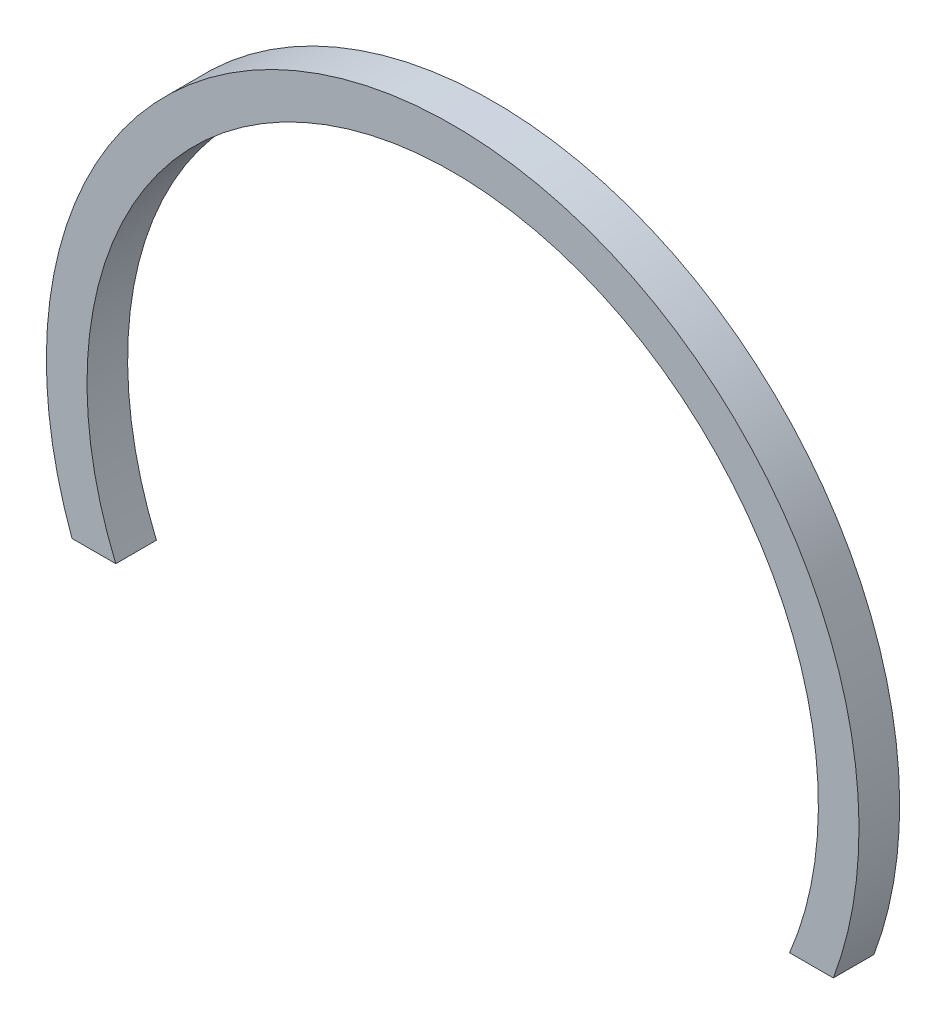
ISO-10303-21;
HEADER;
FILE_DESCRIPTION(('STEP AP214'),'2;1');
FILE_NAME('part.step','',(''),(''),'','','');
FILE_SCHEMA(('AUTOMOTIVE_DESIGN { 1 0 10303 214 1 1 1 1 }'));
ENDSEC;
DATA;
#1=APPLICATION_CONTEXT('core data for automotive mechanical design processes');
#2=APPLICATION_PROTOCOL_DEFINITION('international standard','automotive_design',2000,#1);
#3=PRODUCT_CONTEXT('',#1,'mechanical');
#4=PRODUCT('Part','Part','',(#3));
#5=PRODUCT_RELATED_PRODUCT_CATEGORY('part','',(#4));
#6=PRODUCT_DEFINITION_FORMATION('','',#4);
#7=PRODUCT_DEFINITION_CONTEXT('part definition',#1,'design');
#8=PRODUCT_DEFINITION('design','',#6,#7);
#9=PRODUCT_DEFINITION_SHAPE('','',#8);
#10=(LENGTH_UNIT() NAMED_UNIT(*) SI_UNIT(.MILLI.,.METRE.));
#11=(NAMED_UNIT(*) PLANE_ANGLE_UNIT() SI_UNIT($,.RADIAN.));
#12=(NAMED_UNIT(*) SI_UNIT($,.STERADIAN.) SOLID_ANGLE_UNIT());
#13=UNCERTAINTY_MEASURE_WITH_UNIT(LENGTH_MEASURE(1.E-05),#10,'distance_accuracy_value','');
#14=(GEOMETRIC_REPRESENTATION_CONTEXT(3) GLOBAL_UNCERTAINTY_ASSIGNED_CONTEXT((#13)) GLOBAL_UNIT_ASSIGNED_CONTEXT((#10,
#11,#12)) REPRESENTATION_CONTEXT('',''));
#15=CARTESIAN_POINT('',(0.,0.,0.));
#16=DIRECTION('',(0.,0.,1.));
#17=DIRECTION('',(1.,0.,0.));
#18=AXIS2_PLACEMENT_3D('',#15,#16,#17);
#19=CARTESIAN_POINT('',(0.,0.,3.));
#20=DIRECTION('',(0.,0.,-1.));
#21=DIRECTION('',(-1.,0.,0.));
#22=AXIS2_PLACEMENT_3D('',#19,#20,#21);
#23=CYLINDRICAL_SURFACE('',#22,30.);
#24=DIRECTION('',(0.,0.,-1.));
#25=VECTOR('',#24,1.);
#26=CARTESIAN_POINT('',(-28.1024909927928,-10.5,3.));
#27=LINE('',#26,#25);
#28=CARTESIAN_POINT('',(-28.1024909927928,-10.5,3.));
#29=VERTEX_POINT('',#28);
#30=CARTESIAN_POINT('',(-28.1024909927928,-10.5,0.));
#31=VERTEX_POINT('',#30);
#32=EDGE_CURVE('E94',#29,#31,#27,.T.);
#33=ORIENTED_EDGE('',*,*,#32,.F.);
#34=CARTESIAN_POINT('',(0.,0.,3.));
#35=DIRECTION('',(0.,0.,1.));
#36=DIRECTION('',(1.,0.,0.));
#37=AXIS2_PLACEMENT_3D('',#34,#35,#36);
#38=CIRCLE('',#37,30.);
#39=CARTESIAN_POINT('',(28.1024909927928,-10.5,3.));
#40=VERTEX_POINT('',#39);
#41=EDGE_CURVE('E83',#40,#29,#38,.T.);
#42=ORIENTED_EDGE('',*,*,#41,.F.);
#43=DIRECTION('',(0.,0.,-1.));
#44=VECTOR('',#43,1.);
#45=CARTESIAN_POINT('',(28.1024909927928,-10.5,3.));
#46=LINE('',#45,#44);
#47=CARTESIAN_POINT('',(28.1024909927928,-10.5,0.));
#48=VERTEX_POINT('',#47);
#49=EDGE_CURVE('E103',#48,#40,#46,.F.);
#50=ORIENTED_EDGE('',*,*,#49,.F.);
#51=CARTESIAN_POINT('',(0.,0.,0.));
#52=DIRECTION('',(0.,0.,1.));
#53=DIRECTION('',(1.,0.,0.));
#54=AXIS2_PLACEMENT_3D('',#51,#52,#53);
#55=CIRCLE('',#54,30.);
#56=EDGE_CURVE('E90',#48,#31,#55,.T.);
#57=ORIENTED_EDGE('',*,*,#56,.T.);
#58=EDGE_LOOP('',(#33,#42,#50,#57));
#59=FACE_BOUND('',#58,.T.);
#60=ADVANCED_FACE('F39',(#59),#23,.T.);
#61=CARTESIAN_POINT('',(0.,0.,3.));
#62=DIRECTION('',(0.,0.,1.));
#63=DIRECTION('',(1.,0.,0.));
#64=AXIS2_PLACEMENT_3D('',#61,#62,#63);
#65=PLANE('',#64);
#66=ORIENTED_EDGE('',*,*,#41,.T.);
#67=DIRECTION('',(1.,0.,0.));
#68=VECTOR('',#67,1.);
#69=CARTESIAN_POINT('',(0.,-10.5,3.));
#70=LINE('',#69,#68);
#71=CARTESIAN_POINT('',(-24.8746859276655,-10.5,3.));
#72=VERTEX_POINT('',#71);
#73=EDGE_CURVE('E97',#29,#72,#70,.T.);
#74=ORIENTED_EDGE('',*,*,#73,.T.);
#75=CARTESIAN_POINT('',(0.,0.,3.));
#76=DIRECTION('',(0.,0.,1.));
#77=DIRECTION('',(1.,0.,0.));
#78=AXIS2_PLACEMENT_3D('',#75,#76,#77);
#79=CIRCLE('',#78,27.);
#80=CARTESIAN_POINT('',(24.8746859276655,-10.5,3.));
#81=VERTEX_POINT('',#80);
#82=EDGE_CURVE('E93',#72,#81,#79,.F.);
#83=ORIENTED_EDGE('',*,*,#82,.T.);
#84=EDGE_CURVE('E60',#81,#40,#70,.T.);
#85=ORIENTED_EDGE('',*,*,#84,.T.);
#86=EDGE_LOOP('',(#66,#74,#83,#85));
#87=FACE_BOUND('',#86,.T.);
#88=ADVANCED_FACE('F108',(#87),#65,.T.);
#89=CARTESIAN_POINT('',(0.,0.,0.));
#90=DIRECTION('',(0.,0.,1.));
#91=DIRECTION('',(1.,0.,0.));
#92=AXIS2_PLACEMENT_3D('',#89,#90,#91);
#93=PLANE('',#92);
#94=DIRECTION('',(1.,0.,0.));
#95=VECTOR('',#94,1.);
#96=CARTESIAN_POINT('',(0.,-10.5,0.));
#97=LINE('',#96,#95);
#98=CARTESIAN_POINT('',(-24.8746859276655,-10.5,0.));
#99=VERTEX_POINT('',#98);
#100=EDGE_CURVE('E53',#31,#99,#97,.T.);
#101=ORIENTED_EDGE('',*,*,#100,.F.);
#102=ORIENTED_EDGE('',*,*,#56,.F.);
#103=CARTESIAN_POINT('',(24.8746859276655,-10.5,0.));
#104=VERTEX_POINT('',#103);
#105=EDGE_CURVE('E77',#104,#48,#97,.T.);
#106=ORIENTED_EDGE('',*,*,#105,.F.);
#107=CARTESIAN_POINT('',(0.,0.,0.));
#108=DIRECTION('',(0.,0.,1.));
#109=DIRECTION('',(1.,0.,0.));
#110=AXIS2_PLACEMENT_3D('',#107,#108,#109);
#111=CIRCLE('',#110,27.);
#112=EDGE_CURVE('E88',#99,#104,#111,.F.);
#113=ORIENTED_EDGE('',*,*,#112,.F.);
#114=EDGE_LOOP('',(#101,#102,#106,#113));
#115=FACE_BOUND('',#114,.T.);
#116=ADVANCED_FACE('F87',(#115),#93,.F.);
#117=CARTESIAN_POINT('',(0.,0.,3.1));
#118=DIRECTION('',(0.,0.,-1.));
#119=DIRECTION('',(-1.,0.,0.));
#120=AXIS2_PLACEMENT_3D('',#117,#118,#119);
#121=CYLINDRICAL_SURFACE('',#120,27.);
#122=ORIENTED_EDGE('',*,*,#82,.F.);
#123=DIRECTION('',(0.,0.,-1.));
#124=VECTOR('',#123,1.);
#125=CARTESIAN_POINT('',(-24.8746859276655,-10.5,3.1));
#126=LINE('',#125,#124);
#127=EDGE_CURVE('E11',#72,#99,#126,.T.);
#128=ORIENTED_EDGE('',*,*,#127,.T.);
#129=ORIENTED_EDGE('',*,*,#112,.T.);
#130=DIRECTION('',(0.,0.,-1.));
#131=VECTOR('',#130,1.);
#132=CARTESIAN_POINT('',(24.8746859276655,-10.5,3.1));
#133=LINE('',#132,#131);
#134=EDGE_CURVE('E46',#104,#81,#133,.F.);
#135=ORIENTED_EDGE('',*,*,#134,.T.);
#136=EDGE_LOOP('',(#122,#128,#129,#135));
#137=FACE_BOUND('',#136,.T.);
#138=ADVANCED_FACE('F92',(#137),#121,.F.);
#139=CARTESIAN_POINT('',(-31.,-10.5,3.1));
#140=DIRECTION('',(0.,-1.,0.));
#141=DIRECTION('',(0.,0.,-1.));
#142=AXIS2_PLACEMENT_3D('',#139,#140,#141);
#143=PLANE('',#142);
#144=ORIENTED_EDGE('',*,*,#49,.T.);
#145=ORIENTED_EDGE('',*,*,#84,.F.);
#146=ORIENTED_EDGE('',*,*,#134,.F.);
#147=ORIENTED_EDGE('',*,*,#105,.T.);
#148=EDGE_LOOP('',(#144,#145,#146,#147));
#149=FACE_BOUND('',#148,.T.);
#150=ADVANCED_FACE('F76',(#149),#143,.T.);
#151=ORIENTED_EDGE('',*,*,#32,.T.);
#152=ORIENTED_EDGE('',*,*,#100,.T.);
#153=ORIENTED_EDGE('',*,*,#127,.F.);
#154=ORIENTED_EDGE('',*,*,#73,.F.);
#155=EDGE_LOOP('',(#151,#152,#153,#154));
#156=FACE_BOUND('',#155,.T.);
#157=ADVANCED_FACE('F110',(#156),#143,.T.);
#158=CLOSED_SHELL('',(#60,#88,#116,#138,#150,#157));
#159=MANIFOLD_SOLID_BREP('B2',#158);
#160=ADVANCED_BREP_SHAPE_REPRESENTATION('',(#18,#159),#14);
#161=SHAPE_DEFINITION_REPRESENTATION(#9,#160);
ENDSEC;
END-ISO-10303-21;
